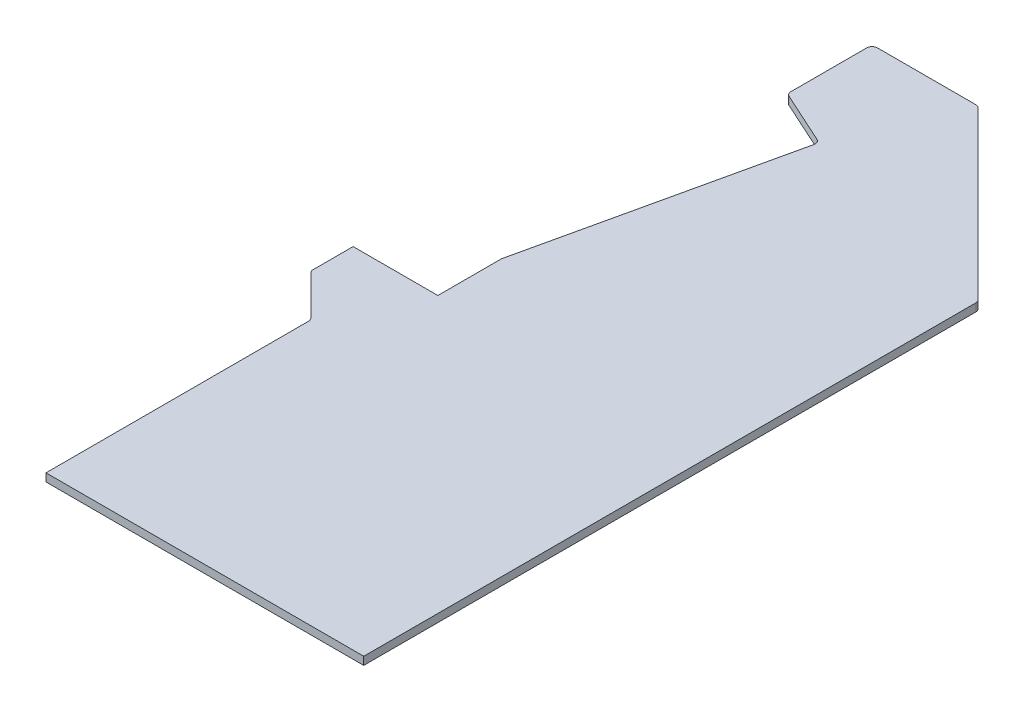
ISO-10303-21;
HEADER;
FILE_DESCRIPTION(('STEP AP214'),'2;1');
FILE_NAME('part.step','',(''),(''),'','','');
FILE_SCHEMA(('AUTOMOTIVE_DESIGN { 1 0 10303 214 1 1 1 1 }'));
ENDSEC;
DATA;
#1=APPLICATION_CONTEXT('core data for automotive mechanical design processes');
#2=APPLICATION_PROTOCOL_DEFINITION('international standard','automotive_design',2000,#1);
#3=PRODUCT_CONTEXT('',#1,'mechanical');
#4=PRODUCT('Part','Part','',(#3));
#5=PRODUCT_RELATED_PRODUCT_CATEGORY('part','',(#4));
#6=PRODUCT_DEFINITION_FORMATION('','',#4);
#7=PRODUCT_DEFINITION_CONTEXT('part definition',#1,'design');
#8=PRODUCT_DEFINITION('design','',#6,#7);
#9=PRODUCT_DEFINITION_SHAPE('','',#8);
#10=(LENGTH_UNIT() NAMED_UNIT(*) SI_UNIT(.MILLI.,.METRE.));
#11=(NAMED_UNIT(*) PLANE_ANGLE_UNIT() SI_UNIT($,.RADIAN.));
#12=(NAMED_UNIT(*) SI_UNIT($,.STERADIAN.) SOLID_ANGLE_UNIT());
#13=UNCERTAINTY_MEASURE_WITH_UNIT(LENGTH_MEASURE(1.E-05),#10,'distance_accuracy_value','');
#14=(GEOMETRIC_REPRESENTATION_CONTEXT(3) GLOBAL_UNCERTAINTY_ASSIGNED_CONTEXT((#13)) GLOBAL_UNIT_ASSIGNED_CONTEXT((#10,
#11,#12)) REPRESENTATION_CONTEXT('',''));
#15=CARTESIAN_POINT('',(0.,0.,0.));
#16=DIRECTION('',(0.,0.,1.));
#17=DIRECTION('',(1.,0.,0.));
#18=AXIS2_PLACEMENT_3D('',#15,#16,#17);
#19=CARTESIAN_POINT('',(-108.534498249528,19.05,3.90321281407813));
#20=DIRECTION('',(0.,0.,-1.));
#21=DIRECTION('',(-1.,0.,0.));
#22=AXIS2_PLACEMENT_3D('',#19,#20,#21);
#23=PLANE('',#22);
#24=DIRECTION('',(1.,0.,0.));
#25=VECTOR('',#24,1.);
#26=CARTESIAN_POINT('',(-108.534498249528,0.,3.90321281407813));
#27=LINE('',#26,#25);
#28=CARTESIAN_POINT('',(-870.534498249528,0.,3.90321281407822));
#29=VERTEX_POINT('',#28);
#30=CARTESIAN_POINT('',(-108.534498249528,0.,3.90321281407813));
#31=VERTEX_POINT('',#30);
#32=EDGE_CURVE('E194',#29,#31,#27,.T.);
#33=ORIENTED_EDGE('',*,*,#32,.T.);
#34=DIRECTION('',(0.,-1.,0.));
#35=VECTOR('',#34,1.);
#36=CARTESIAN_POINT('',(-108.534498249528,19.05,3.90321281407813));
#37=LINE('',#36,#35);
#38=CARTESIAN_POINT('',(-108.534498249528,19.05,3.90321281407813));
#39=VERTEX_POINT('',#38);
#40=EDGE_CURVE('E11',#39,#31,#37,.T.);
#41=ORIENTED_EDGE('',*,*,#40,.F.);
#42=DIRECTION('',(1.,0.,0.));
#43=VECTOR('',#42,1.);
#44=CARTESIAN_POINT('',(-108.534498249528,19.05,3.90321281407813));
#45=LINE('',#44,#43);
#46=CARTESIAN_POINT('',(-870.534498249528,19.05,3.90321281407822));
#47=VERTEX_POINT('',#46);
#48=EDGE_CURVE('E230',#47,#39,#45,.T.);
#49=ORIENTED_EDGE('',*,*,#48,.F.);
#50=DIRECTION('',(0.,-1.,0.));
#51=VECTOR('',#50,1.);
#52=CARTESIAN_POINT('',(-870.534498249528,19.05,3.90321281407822));
#53=LINE('',#52,#51);
#54=EDGE_CURVE('E190',#47,#29,#53,.T.);
#55=ORIENTED_EDGE('',*,*,#54,.T.);
#56=EDGE_LOOP('',(#33,#41,#49,#55));
#57=FACE_BOUND('',#56,.T.);
#58=ADVANCED_FACE('F32',(#57),#23,.F.);
#59=CARTESIAN_POINT('',(-108.534498249528,19.05,3.90321281407813));
#60=DIRECTION('',(-1.,0.,0.));
#61=DIRECTION('',(0.,0.,1.));
#62=AXIS2_PLACEMENT_3D('',#59,#60,#61);
#63=PLANE('',#62);
#64=DIRECTION('',(0.,0.,-1.));
#65=VECTOR('',#64,1.);
#66=CARTESIAN_POINT('',(-108.534498249528,0.,3.90321281407813));
#67=LINE('',#66,#65);
#68=CARTESIAN_POINT('',(-108.534498249528,0.,-1464.03627494378));
#69=VERTEX_POINT('',#68);
#70=EDGE_CURVE('E197',#31,#69,#67,.T.);
#71=ORIENTED_EDGE('',*,*,#70,.T.);
#72=DIRECTION('',(0.,-1.,0.));
#73=VECTOR('',#72,1.);
#74=CARTESIAN_POINT('',(-108.534498249528,19.05,-1464.03627494378));
#75=LINE('',#74,#73);
#76=CARTESIAN_POINT('',(-108.534498249528,19.05,-1464.03627494378));
#77=VERTEX_POINT('',#76);
#78=EDGE_CURVE('E40',#77,#69,#75,.T.);
#79=ORIENTED_EDGE('',*,*,#78,.F.);
#80=DIRECTION('',(0.,0.,-1.));
#81=VECTOR('',#80,1.);
#82=CARTESIAN_POINT('',(-108.534498249528,19.05,3.90321281407813));
#83=LINE('',#82,#81);
#84=EDGE_CURVE('E124',#39,#77,#83,.T.);
#85=ORIENTED_EDGE('',*,*,#84,.F.);
#86=ORIENTED_EDGE('',*,*,#40,.T.);
#87=EDGE_LOOP('',(#71,#79,#85,#86));
#88=FACE_BOUND('',#87,.T.);
#89=ADVANCED_FACE('F343',(#88),#63,.F.);
#90=CARTESIAN_POINT('',(-121.234498249528,19.05,-1464.03627494378));
#91=DIRECTION('',(0.,-1.,0.));
#92=DIRECTION('',(0.,0.,-1.));
#93=AXIS2_PLACEMENT_3D('',#90,#91,#92);
#94=CYLINDRICAL_SURFACE('',#93,12.7);
#95=CARTESIAN_POINT('',(-121.234498249528,0.,-1464.03627494378));
#96=DIRECTION('',(0.,1.,0.));
#97=DIRECTION('',(0.,0.,1.));
#98=AXIS2_PLACEMENT_3D('',#95,#96,#97);
#99=CIRCLE('',#98,12.7);
#100=CARTESIAN_POINT('',(-112.254242128458,0.,-1473.01653106485));
#101=VERTEX_POINT('',#100);
#102=EDGE_CURVE('E199',#69,#101,#99,.T.);
#103=ORIENTED_EDGE('',*,*,#102,.T.);
#104=DIRECTION('',(0.,-1.,0.));
#105=VECTOR('',#104,1.);
#106=CARTESIAN_POINT('',(-112.254242128458,19.05,-1473.01653106485));
#107=LINE('',#106,#105);
#108=CARTESIAN_POINT('',(-112.254242128458,19.05,-1473.01653106485));
#109=VERTEX_POINT('',#108);
#110=EDGE_CURVE('E270',#109,#101,#107,.T.);
#111=ORIENTED_EDGE('',*,*,#110,.F.);
#112=CARTESIAN_POINT('',(-121.234498249528,19.05,-1464.03627494378));
#113=DIRECTION('',(0.,1.,0.));
#114=DIRECTION('',(0.,0.,1.));
#115=AXIS2_PLACEMENT_3D('',#112,#113,#114);
#116=CIRCLE('',#115,12.7);
#117=EDGE_CURVE('E278',#77,#109,#116,.T.);
#118=ORIENTED_EDGE('',*,*,#117,.F.);
#119=ORIENTED_EDGE('',*,*,#78,.T.);
#120=EDGE_LOOP('',(#103,#111,#118,#119));
#121=FACE_BOUND('',#120,.T.);
#122=ADVANCED_FACE('F276',(#121),#94,.T.);
#123=CARTESIAN_POINT('',(-112.254242128458,19.05,-1473.01653106485));
#124=DIRECTION('',(-0.707106781186548,0.,0.707106781186547));
#125=DIRECTION('',(0.707106781186547,0.,0.707106781186548));
#126=AXIS2_PLACEMENT_3D('',#123,#124,#125);
#127=PLANE('',#126);
#128=DIRECTION('',(-0.707106781186548,0.,-0.707106781186548));
#129=VECTOR('',#128,1.);
#130=CARTESIAN_POINT('',(-112.254242128458,0.,-1473.01653106485));
#131=LINE('',#130,#129);
#132=CARTESIAN_POINT('',(-511.214754370597,0.,-1871.97704330699));
#133=VERTEX_POINT('',#132);
#134=EDGE_CURVE('E201',#101,#133,#131,.T.);
#135=ORIENTED_EDGE('',*,*,#134,.T.);
#136=DIRECTION('',(0.,-1.,0.));
#137=VECTOR('',#136,1.);
#138=CARTESIAN_POINT('',(-511.214754370597,19.05,-1871.97704330699));
#139=LINE('',#138,#137);
#140=CARTESIAN_POINT('',(-511.214754370597,19.05,-1871.97704330699));
#141=VERTEX_POINT('',#140);
#142=EDGE_CURVE('E267',#141,#133,#139,.T.);
#143=ORIENTED_EDGE('',*,*,#142,.F.);
#144=DIRECTION('',(-0.707106781186548,0.,-0.707106781186548));
#145=VECTOR('',#144,1.);
#146=CARTESIAN_POINT('',(-112.254242128458,19.05,-1473.01653106485));
#147=LINE('',#146,#145);
#148=EDGE_CURVE('E296',#109,#141,#147,.T.);
#149=ORIENTED_EDGE('',*,*,#148,.F.);
#150=ORIENTED_EDGE('',*,*,#110,.T.);
#151=EDGE_LOOP('',(#135,#143,#149,#150));
#152=FACE_BOUND('',#151,.T.);
#153=ADVANCED_FACE('F287',(#152),#127,.F.);
#154=CARTESIAN_POINT('',(-520.195010491666,19.05,-1862.99678718592));
#155=DIRECTION('',(0.,-1.,0.));
#156=DIRECTION('',(0.,0.,-1.));
#157=AXIS2_PLACEMENT_3D('',#154,#155,#156);
#158=CYLINDRICAL_SURFACE('',#157,12.6999999999999);
#159=CARTESIAN_POINT('',(-520.195010491666,0.,-1862.99678718592));
#160=DIRECTION('',(0.,1.,0.));
#161=DIRECTION('',(0.,0.,1.));
#162=AXIS2_PLACEMENT_3D('',#159,#160,#161);
#163=CIRCLE('',#162,12.6999999999999);
#164=CARTESIAN_POINT('',(-520.195010491666,0.,-1875.69678718592));
#165=VERTEX_POINT('',#164);
#166=EDGE_CURVE('E203',#133,#165,#163,.T.);
#167=ORIENTED_EDGE('',*,*,#166,.T.);
#168=DIRECTION('',(0.,-1.,0.));
#169=VECTOR('',#168,1.);
#170=CARTESIAN_POINT('',(-520.195010491666,19.05,-1875.69678718592));
#171=LINE('',#170,#169);
#172=CARTESIAN_POINT('',(-520.195010491666,19.05,-1875.69678718592));
#173=VERTEX_POINT('',#172);
#174=EDGE_CURVE('E264',#173,#165,#171,.T.);
#175=ORIENTED_EDGE('',*,*,#174,.F.);
#176=CARTESIAN_POINT('',(-520.195010491666,19.05,-1862.99678718592));
#177=DIRECTION('',(0.,1.,0.));
#178=DIRECTION('',(0.,0.,1.));
#179=AXIS2_PLACEMENT_3D('',#176,#177,#178);
#180=CIRCLE('',#179,12.6999999999999);
#181=EDGE_CURVE('E293',#141,#173,#180,.T.);
#182=ORIENTED_EDGE('',*,*,#181,.F.);
#183=ORIENTED_EDGE('',*,*,#142,.T.);
#184=EDGE_LOOP('',(#167,#175,#182,#183));
#185=FACE_BOUND('',#184,.T.);
#186=ADVANCED_FACE('F291',(#185),#158,.T.);
#187=CARTESIAN_POINT('',(-520.195010491666,19.05,-1875.69678718592));
#188=DIRECTION('',(0.,0.,1.));
#189=DIRECTION('',(1.,0.,0.));
#190=AXIS2_PLACEMENT_3D('',#187,#188,#189);
#191=PLANE('',#190);
#192=DIRECTION('',(-1.,0.,0.));
#193=VECTOR('',#192,1.);
#194=CARTESIAN_POINT('',(-520.195010491666,0.,-1875.69678718592));
#195=LINE('',#194,#193);
#196=CARTESIAN_POINT('',(-756.234498249528,0.,-1875.69678718592));
#197=VERTEX_POINT('',#196);
#198=EDGE_CURVE('E205',#165,#197,#195,.T.);
#199=ORIENTED_EDGE('',*,*,#198,.T.);
#200=DIRECTION('',(0.,-1.,0.));
#201=VECTOR('',#200,1.);
#202=CARTESIAN_POINT('',(-756.234498249528,19.05,-1875.69678718592));
#203=LINE('',#202,#201);
#204=CARTESIAN_POINT('',(-756.234498249528,19.05,-1875.69678718592));
#205=VERTEX_POINT('',#204);
#206=EDGE_CURVE('E261',#205,#197,#203,.T.);
#207=ORIENTED_EDGE('',*,*,#206,.F.);
#208=DIRECTION('',(-1.,0.,0.));
#209=VECTOR('',#208,1.);
#210=CARTESIAN_POINT('',(-520.195010491666,19.05,-1875.69678718592));
#211=LINE('',#210,#209);
#212=EDGE_CURVE('E295',#173,#205,#211,.T.);
#213=ORIENTED_EDGE('',*,*,#212,.F.);
#214=ORIENTED_EDGE('',*,*,#174,.T.);
#215=EDGE_LOOP('',(#199,#207,#213,#214));
#216=FACE_BOUND('',#215,.T.);
#217=ADVANCED_FACE('F356',(#216),#191,.F.);
#218=CARTESIAN_POINT('',(-756.234498249528,19.05,-1862.99678718592));
#219=DIRECTION('',(0.,-1.,0.));
#220=DIRECTION('',(0.,0.,-1.));
#221=AXIS2_PLACEMENT_3D('',#218,#219,#220);
#222=CYLINDRICAL_SURFACE('',#221,12.6999999999999);
#223=CARTESIAN_POINT('',(-756.234498249528,0.,-1862.99678718592));
#224=DIRECTION('',(0.,1.,0.));
#225=DIRECTION('',(0.,0.,-1.));
#226=AXIS2_PLACEMENT_3D('',#223,#224,#225);
#227=CIRCLE('',#226,12.6999999999999);
#228=CARTESIAN_POINT('',(-768.934498249528,0.,-1862.99678718592));
#229=VERTEX_POINT('',#228);
#230=EDGE_CURVE('E207',#197,#229,#227,.T.);
#231=ORIENTED_EDGE('',*,*,#230,.T.);
#232=DIRECTION('',(0.,-1.,0.));
#233=VECTOR('',#232,1.);
#234=CARTESIAN_POINT('',(-768.934498249528,19.05,-1862.99678718592));
#235=LINE('',#234,#233);
#236=CARTESIAN_POINT('',(-768.934498249528,19.05,-1862.99678718592));
#237=VERTEX_POINT('',#236);
#238=EDGE_CURVE('E258',#237,#229,#235,.T.);
#239=ORIENTED_EDGE('',*,*,#238,.F.);
#240=CARTESIAN_POINT('',(-756.234498249528,19.05,-1862.99678718592));
#241=DIRECTION('',(0.,1.,0.));
#242=DIRECTION('',(0.,0.,-1.));
#243=AXIS2_PLACEMENT_3D('',#240,#241,#242);
#244=CIRCLE('',#243,12.6999999999999);
#245=EDGE_CURVE('E298',#205,#237,#244,.T.);
#246=ORIENTED_EDGE('',*,*,#245,.F.);
#247=ORIENTED_EDGE('',*,*,#206,.T.);
#248=EDGE_LOOP('',(#231,#239,#246,#247));
#249=FACE_BOUND('',#248,.T.);
#250=ADVANCED_FACE('F359',(#249),#222,.T.);
#251=CARTESIAN_POINT('',(-768.934498249528,19.05,-1680.67448571907));
#252=DIRECTION('',(1.,0.,0.));
#253=DIRECTION('',(0.,0.,-1.));
#254=AXIS2_PLACEMENT_3D('',#251,#252,#253);
#255=PLANE('',#254);
#256=DIRECTION('',(0.,0.,1.));
#257=VECTOR('',#256,1.);
#258=CARTESIAN_POINT('',(-768.934498249528,0.,-1680.67448571907));
#259=LINE('',#258,#257);
#260=CARTESIAN_POINT('',(-768.934498249528,0.,-1680.67448571907));
#261=VERTEX_POINT('',#260);
#262=EDGE_CURVE('E209',#229,#261,#259,.T.);
#263=ORIENTED_EDGE('',*,*,#262,.T.);
#264=DIRECTION('',(0.,-1.,0.));
#265=VECTOR('',#264,1.);
#266=CARTESIAN_POINT('',(-768.934498249528,19.05,-1680.67448571907));
#267=LINE('',#266,#265);
#268=CARTESIAN_POINT('',(-768.934498249528,19.05,-1680.67448571907));
#269=VERTEX_POINT('',#268);
#270=EDGE_CURVE('E255',#269,#261,#267,.T.);
#271=ORIENTED_EDGE('',*,*,#270,.F.);
#272=DIRECTION('',(0.,0.,1.));
#273=VECTOR('',#272,1.);
#274=CARTESIAN_POINT('',(-768.934498249528,19.05,-1680.67448571907));
#275=LINE('',#274,#273);
#276=EDGE_CURVE('E304',#237,#269,#275,.T.);
#277=ORIENTED_EDGE('',*,*,#276,.F.);
#278=ORIENTED_EDGE('',*,*,#238,.T.);
#279=EDGE_LOOP('',(#263,#271,#277,#278));
#280=FACE_BOUND('',#279,.T.);
#281=ADVANCED_FACE('F363',(#280),#255,.F.);
#282=CARTESIAN_POINT('',(-756.234498249528,19.05,-1680.67448571907));
#283=DIRECTION('',(0.,-1.,0.));
#284=DIRECTION('',(0.,0.,-1.));
#285=AXIS2_PLACEMENT_3D('',#282,#283,#284);
#286=CYLINDRICAL_SURFACE('',#285,12.7);
#287=CARTESIAN_POINT('',(-756.234498249528,0.,-1680.67448571907));
#288=DIRECTION('',(0.,1.,0.));
#289=DIRECTION('',(0.,0.,1.));
#290=AXIS2_PLACEMENT_3D('',#287,#288,#289);
#291=CIRCLE('',#290,12.7);
#292=CARTESIAN_POINT('',(-761.489795642153,0.,-1669.1128314553));
#293=VERTEX_POINT('',#292);
#294=EDGE_CURVE('E211',#261,#293,#291,.T.);
#295=ORIENTED_EDGE('',*,*,#294,.T.);
#296=DIRECTION('',(0.,-1.,0.));
#297=VECTOR('',#296,1.);
#298=CARTESIAN_POINT('',(-761.489795642153,19.05,-1669.1128314553));
#299=LINE('',#298,#297);
#300=CARTESIAN_POINT('',(-761.489795642153,19.05,-1669.1128314553));
#301=VERTEX_POINT('',#300);
#302=EDGE_CURVE('E252',#301,#293,#299,.T.);
#303=ORIENTED_EDGE('',*,*,#302,.F.);
#304=CARTESIAN_POINT('',(-756.234498249528,19.05,-1680.67448571907));
#305=DIRECTION('',(0.,1.,0.));
#306=DIRECTION('',(0.,0.,1.));
#307=AXIS2_PLACEMENT_3D('',#304,#305,#306);
#308=CIRCLE('',#307,12.7);
#309=EDGE_CURVE('E306',#269,#301,#308,.T.);
#310=ORIENTED_EDGE('',*,*,#309,.F.);
#311=ORIENTED_EDGE('',*,*,#270,.T.);
#312=EDGE_LOOP('',(#295,#303,#310,#311));
#313=FACE_BOUND('',#312,.T.);
#314=ADVANCED_FACE('F367',(#313),#286,.T.);
#315=CARTESIAN_POINT('',(-761.489795642153,19.05,-1669.1128314553));
#316=DIRECTION('',(0.413802944301183,0.,-0.910366477462605));
#317=DIRECTION('',(-0.910366477462605,0.,-0.413802944301183));
#318=AXIS2_PLACEMENT_3D('',#315,#316,#317);
#319=PLANE('',#318);
#320=DIRECTION('',(0.910366477462605,0.,0.413802944301183));
#321=VECTOR('',#320,1.);
#322=CARTESIAN_POINT('',(-761.489795642153,0.,-1669.1128314553));
#323=LINE('',#322,#321);
#324=CARTESIAN_POINT('',(-638.631840930286,0.,-1613.26830658627));
#325=VERTEX_POINT('',#324);
#326=EDGE_CURVE('E213',#293,#325,#323,.T.);
#327=ORIENTED_EDGE('',*,*,#326,.T.);
#328=DIRECTION('',(0.,-1.,0.));
#329=VECTOR('',#328,1.);
#330=CARTESIAN_POINT('',(-638.631840930286,19.05,-1613.26830658627));
#331=LINE('',#330,#329);
#332=CARTESIAN_POINT('',(-638.631840930286,19.05,-1613.26830658627));
#333=VERTEX_POINT('',#332);
#334=EDGE_CURVE('E249',#333,#325,#331,.T.);
#335=ORIENTED_EDGE('',*,*,#334,.F.);
#336=DIRECTION('',(0.910366477462605,0.,0.413802944301183));
#337=VECTOR('',#336,1.);
#338=CARTESIAN_POINT('',(-761.489795642153,19.05,-1669.1128314553));
#339=LINE('',#338,#337);
#340=EDGE_CURVE('E308',#301,#333,#339,.T.);
#341=ORIENTED_EDGE('',*,*,#340,.F.);
#342=ORIENTED_EDGE('',*,*,#302,.T.);
#343=EDGE_LOOP('',(#327,#335,#341,#342));
#344=FACE_BOUND('',#343,.T.);
#345=ADVANCED_FACE('F371',(#344),#319,.F.);
#346=CARTESIAN_POINT('',(-643.887138322911,19.05,-1601.70665232249));
#347=DIRECTION('',(0.,-1.,0.));
#348=DIRECTION('',(0.,0.,-1.));
#349=AXIS2_PLACEMENT_3D('',#346,#347,#348);
#350=CYLINDRICAL_SURFACE('',#349,12.7);
#351=CARTESIAN_POINT('',(-643.887138322911,0.,-1601.70665232249));
#352=DIRECTION('',(0.,-1.,0.));
#353=DIRECTION('',(0.,0.,1.));
#354=AXIS2_PLACEMENT_3D('',#351,#352,#353);
#355=CIRCLE('',#354,12.7);
#356=CARTESIAN_POINT('',(-631.495541921323,0.,-1598.9248653752));
#357=VERTEX_POINT('',#356);
#358=EDGE_CURVE('E215',#325,#357,#355,.T.);
#359=ORIENTED_EDGE('',*,*,#358,.T.);
#360=DIRECTION('',(0.,-1.,0.));
#361=VECTOR('',#360,1.);
#362=CARTESIAN_POINT('',(-631.495541921323,19.05,-1598.9248653752));
#363=LINE('',#362,#361);
#364=CARTESIAN_POINT('',(-631.495541921323,19.05,-1598.9248653752));
#365=VERTEX_POINT('',#364);
#366=EDGE_CURVE('E246',#365,#357,#363,.T.);
#367=ORIENTED_EDGE('',*,*,#366,.F.);
#368=CARTESIAN_POINT('',(-643.887138322911,19.05,-1601.70665232249));
#369=DIRECTION('',(0.,-1.,0.));
#370=DIRECTION('',(0.,0.,1.));
#371=AXIS2_PLACEMENT_3D('',#368,#369,#370);
#372=CIRCLE('',#371,12.7);
#373=EDGE_CURVE('E310',#333,#365,#372,.T.);
#374=ORIENTED_EDGE('',*,*,#373,.F.);
#375=ORIENTED_EDGE('',*,*,#334,.T.);
#376=EDGE_LOOP('',(#359,#367,#374,#375));
#377=FACE_BOUND('',#376,.T.);
#378=ADVANCED_FACE('F375',(#377),#350,.F.);
#379=CARTESIAN_POINT('',(-631.495541921323,19.05,-1598.9248653752));
#380=DIRECTION('',(0.975716252093571,0.,0.21903834230672));
#381=DIRECTION('',(0.21903834230672,0.,-0.975716252093571));
#382=AXIS2_PLACEMENT_3D('',#379,#380,#381);
#383=PLANE('',#382);
#384=DIRECTION('',(-0.21903834230672,0.,0.97571625209357));
#385=VECTOR('',#384,1.);
#386=CARTESIAN_POINT('',(-631.495541921323,0.,-1598.9248653752));
#387=LINE('',#386,#385);
#388=CARTESIAN_POINT('',(-768.934498249528,0.,-986.696787185922));
#389=VERTEX_POINT('',#388);
#390=EDGE_CURVE('E217',#357,#389,#387,.T.);
#391=ORIENTED_EDGE('',*,*,#390,.T.);
#392=DIRECTION('',(0.,-1.,0.));
#393=VECTOR('',#392,1.);
#394=CARTESIAN_POINT('',(-768.934498249528,19.05,-986.696787185922));
#395=LINE('',#394,#393);
#396=CARTESIAN_POINT('',(-768.934498249528,19.05,-986.696787185922));
#397=VERTEX_POINT('',#396);
#398=EDGE_CURVE('E243',#397,#389,#395,.T.);
#399=ORIENTED_EDGE('',*,*,#398,.F.);
#400=DIRECTION('',(-0.21903834230672,0.,0.97571625209357));
#401=VECTOR('',#400,1.);
#402=CARTESIAN_POINT('',(-631.495541921323,19.05,-1598.9248653752));
#403=LINE('',#402,#401);
#404=EDGE_CURVE('E312',#365,#397,#403,.T.);
#405=ORIENTED_EDGE('',*,*,#404,.F.);
#406=ORIENTED_EDGE('',*,*,#366,.T.);
#407=EDGE_LOOP('',(#391,#399,#405,#406));
#408=FACE_BOUND('',#407,.T.);
#409=ADVANCED_FACE('F379',(#408),#383,.F.);
#410=CARTESIAN_POINT('',(-768.934498249528,19.05,-834.296787185922));
#411=DIRECTION('',(1.,0.,0.));
#412=DIRECTION('',(0.,0.,-1.));
#413=AXIS2_PLACEMENT_3D('',#410,#411,#412);
#414=PLANE('',#413);
#415=DIRECTION('',(0.,0.,1.));
#416=VECTOR('',#415,1.);
#417=CARTESIAN_POINT('',(-768.934498249528,0.,-834.296787185922));
#418=LINE('',#417,#416);
#419=CARTESIAN_POINT('',(-768.934498249528,0.,-834.296787185922));
#420=VERTEX_POINT('',#419);
#421=EDGE_CURVE('E219',#389,#420,#418,.T.);
#422=ORIENTED_EDGE('',*,*,#421,.T.);
#423=DIRECTION('',(0.,-1.,0.));
#424=VECTOR('',#423,1.);
#425=CARTESIAN_POINT('',(-768.934498249528,19.05,-834.296787185922));
#426=LINE('',#425,#424);
#427=CARTESIAN_POINT('',(-768.934498249528,19.05,-834.296787185922));
#428=VERTEX_POINT('',#427);
#429=EDGE_CURVE('E240',#428,#420,#426,.T.);
#430=ORIENTED_EDGE('',*,*,#429,.F.);
#431=DIRECTION('',(0.,0.,1.));
#432=VECTOR('',#431,1.);
#433=CARTESIAN_POINT('',(-768.934498249528,19.05,-834.296787185922));
#434=LINE('',#433,#432);
#435=EDGE_CURVE('E314',#397,#428,#434,.T.);
#436=ORIENTED_EDGE('',*,*,#435,.F.);
#437=ORIENTED_EDGE('',*,*,#398,.T.);
#438=EDGE_LOOP('',(#422,#430,#436,#437));
#439=FACE_BOUND('',#438,.T.);
#440=ADVANCED_FACE('F383',(#439),#414,.F.);
#441=CARTESIAN_POINT('',(-972.134498249528,19.05,-834.296787185922));
#442=DIRECTION('',(0.,0.,1.));
#443=DIRECTION('',(1.,0.,0.));
#444=AXIS2_PLACEMENT_3D('',#441,#442,#443);
#445=PLANE('',#444);
#446=DIRECTION('',(-1.,0.,0.));
#447=VECTOR('',#446,1.);
#448=CARTESIAN_POINT('',(-972.134498249528,0.,-834.296787185922));
#449=LINE('',#448,#447);
#450=CARTESIAN_POINT('',(-972.134498249528,0.,-834.296787185922));
#451=VERTEX_POINT('',#450);
#452=EDGE_CURVE('E221',#420,#451,#449,.T.);
#453=ORIENTED_EDGE('',*,*,#452,.T.);
#454=DIRECTION('',(0.,-1.,0.));
#455=VECTOR('',#454,1.);
#456=CARTESIAN_POINT('',(-972.134498249528,19.05,-834.296787185922));
#457=LINE('',#456,#455);
#458=CARTESIAN_POINT('',(-972.134498249528,19.05,-834.296787185922));
#459=VERTEX_POINT('',#458);
#460=EDGE_CURVE('E237',#459,#451,#457,.T.);
#461=ORIENTED_EDGE('',*,*,#460,.F.);
#462=DIRECTION('',(-1.,0.,0.));
#463=VECTOR('',#462,1.);
#464=CARTESIAN_POINT('',(-972.134498249528,19.05,-834.296787185922));
#465=LINE('',#464,#463);
#466=EDGE_CURVE('E316',#428,#459,#465,.T.);
#467=ORIENTED_EDGE('',*,*,#466,.F.);
#468=ORIENTED_EDGE('',*,*,#429,.T.);
#469=EDGE_LOOP('',(#453,#461,#467,#468));
#470=FACE_BOUND('',#469,.T.);
#471=ADVANCED_FACE('F387',(#470),#445,.F.);
#472=CARTESIAN_POINT('',(-972.134498249528,19.05,-737.95729942806));
#473=DIRECTION('',(1.,0.,0.));
#474=DIRECTION('',(0.,0.,-1.));
#475=AXIS2_PLACEMENT_3D('',#472,#473,#474);
#476=PLANE('',#475);
#477=DIRECTION('',(0.,0.,1.));
#478=VECTOR('',#477,1.);
#479=CARTESIAN_POINT('',(-972.134498249528,0.,-737.95729942806));
#480=LINE('',#479,#478);
#481=CARTESIAN_POINT('',(-972.134498249528,0.,-737.95729942806));
#482=VERTEX_POINT('',#481);
#483=EDGE_CURVE('E223',#451,#482,#480,.T.);
#484=ORIENTED_EDGE('',*,*,#483,.T.);
#485=DIRECTION('',(0.,-1.,0.));
#486=VECTOR('',#485,1.);
#487=CARTESIAN_POINT('',(-972.134498249528,19.05,-737.95729942806));
#488=LINE('',#487,#486);
#489=CARTESIAN_POINT('',(-972.134498249528,19.05,-737.95729942806));
#490=VERTEX_POINT('',#489);
#491=EDGE_CURVE('E234',#490,#482,#488,.T.);
#492=ORIENTED_EDGE('',*,*,#491,.F.);
#493=DIRECTION('',(0.,0.,1.));
#494=VECTOR('',#493,1.);
#495=CARTESIAN_POINT('',(-972.134498249528,19.05,-737.95729942806));
#496=LINE('',#495,#494);
#497=EDGE_CURVE('E318',#459,#490,#496,.T.);
#498=ORIENTED_EDGE('',*,*,#497,.F.);
#499=ORIENTED_EDGE('',*,*,#460,.T.);
#500=EDGE_LOOP('',(#484,#492,#498,#499));
#501=FACE_BOUND('',#500,.T.);
#502=ADVANCED_FACE('F324',(#501),#476,.F.);
#503=CARTESIAN_POINT('',(-959.434498249528,19.05,-737.95729942806));
#504=DIRECTION('',(0.,-1.,0.));
#505=DIRECTION('',(0.,0.,-1.));
#506=AXIS2_PLACEMENT_3D('',#503,#504,#505);
#507=CYLINDRICAL_SURFACE('',#506,12.7);
#508=CARTESIAN_POINT('',(-959.434498249528,0.,-737.95729942806));
#509=DIRECTION('',(0.,1.,0.));
#510=DIRECTION('',(0.,0.,1.));
#511=AXIS2_PLACEMENT_3D('',#508,#509,#510);
#512=CIRCLE('',#511,12.7);
#513=CARTESIAN_POINT('',(-968.414754370597,0.,-728.977043306991));
#514=VERTEX_POINT('',#513);
#515=EDGE_CURVE('E225',#482,#514,#512,.T.);
#516=ORIENTED_EDGE('',*,*,#515,.T.);
#517=DIRECTION('',(0.,-1.,0.));
#518=VECTOR('',#517,1.);
#519=CARTESIAN_POINT('',(-968.414754370597,19.05,-728.977043306991));
#520=LINE('',#519,#518);
#521=CARTESIAN_POINT('',(-968.414754370597,19.05,-728.977043306991));
#522=VERTEX_POINT('',#521);
#523=EDGE_CURVE('E185',#522,#514,#520,.T.);
#524=ORIENTED_EDGE('',*,*,#523,.F.);
#525=CARTESIAN_POINT('',(-959.434498249528,19.05,-737.95729942806));
#526=DIRECTION('',(0.,1.,0.));
#527=DIRECTION('',(0.,0.,1.));
#528=AXIS2_PLACEMENT_3D('',#525,#526,#527);
#529=CIRCLE('',#528,12.7);
#530=EDGE_CURVE('E176',#490,#522,#529,.T.);
#531=ORIENTED_EDGE('',*,*,#530,.F.);
#532=ORIENTED_EDGE('',*,*,#491,.T.);
#533=EDGE_LOOP('',(#516,#524,#531,#532));
#534=FACE_BOUND('',#533,.T.);
#535=ADVANCED_FACE('F328',(#534),#507,.T.);
#536=CARTESIAN_POINT('',(-968.414754370597,19.05,-728.977043306991));
#537=DIRECTION('',(0.707106781186547,0.,-0.707106781186548));
#538=DIRECTION('',(-0.707106781186548,0.,-0.707106781186547));
#539=AXIS2_PLACEMENT_3D('',#536,#537,#538);
#540=PLANE('',#539);
#541=DIRECTION('',(0.707106781186548,0.,0.707106781186547));
#542=VECTOR('',#541,1.);
#543=CARTESIAN_POINT('',(-968.414754370597,0.,-728.977043306991));
#544=LINE('',#543,#542);
#545=CARTESIAN_POINT('',(-874.254242128458,0.,-634.816531064853));
#546=VERTEX_POINT('',#545);
#547=EDGE_CURVE('E184',#514,#546,#544,.T.);
#548=ORIENTED_EDGE('',*,*,#547,.T.);
#549=DIRECTION('',(0.,-1.,0.));
#550=VECTOR('',#549,1.);
#551=CARTESIAN_POINT('',(-874.254242128458,19.05,-634.816531064853));
#552=LINE('',#551,#550);
#553=CARTESIAN_POINT('',(-874.254242128458,19.05,-634.816531064853));
#554=VERTEX_POINT('',#553);
#555=EDGE_CURVE('E181',#554,#546,#552,.T.);
#556=ORIENTED_EDGE('',*,*,#555,.F.);
#557=DIRECTION('',(0.707106781186548,0.,0.707106781186547));
#558=VECTOR('',#557,1.);
#559=CARTESIAN_POINT('',(-968.414754370597,19.05,-728.977043306991));
#560=LINE('',#559,#558);
#561=EDGE_CURVE('E170',#522,#554,#560,.T.);
#562=ORIENTED_EDGE('',*,*,#561,.F.);
#563=ORIENTED_EDGE('',*,*,#523,.T.);
#564=EDGE_LOOP('',(#548,#556,#562,#563));
#565=FACE_BOUND('',#564,.T.);
#566=ADVANCED_FACE('F182',(#565),#540,.F.);
#567=CARTESIAN_POINT('',(-883.234498249528,19.05,-625.836274943783));
#568=DIRECTION('',(0.,-1.,0.));
#569=DIRECTION('',(0.,0.,-1.));
#570=AXIS2_PLACEMENT_3D('',#567,#568,#569);
#571=CYLINDRICAL_SURFACE('',#570,12.7);
#572=CARTESIAN_POINT('',(-883.234498249528,0.,-625.836274943783));
#573=DIRECTION('',(0.,-1.,0.));
#574=DIRECTION('',(0.,0.,1.));
#575=AXIS2_PLACEMENT_3D('',#572,#573,#574);
#576=CIRCLE('',#575,12.7);
#577=CARTESIAN_POINT('',(-870.534498249528,0.,-625.836274943783));
#578=VERTEX_POINT('',#577);
#579=EDGE_CURVE('E110',#546,#578,#576,.T.);
#580=ORIENTED_EDGE('',*,*,#579,.T.);
#581=DIRECTION('',(0.,-1.,0.));
#582=VECTOR('',#581,1.);
#583=CARTESIAN_POINT('',(-870.534498249528,19.05,-625.836274943783));
#584=LINE('',#583,#582);
#585=CARTESIAN_POINT('',(-870.534498249528,19.05,-625.836274943783));
#586=VERTEX_POINT('',#585);
#587=EDGE_CURVE('E186',#586,#578,#584,.T.);
#588=ORIENTED_EDGE('',*,*,#587,.F.);
#589=CARTESIAN_POINT('',(-883.234498249528,19.05,-625.836274943783));
#590=DIRECTION('',(0.,-1.,0.));
#591=DIRECTION('',(0.,0.,1.));
#592=AXIS2_PLACEMENT_3D('',#589,#590,#591);
#593=CIRCLE('',#592,12.7);
#594=EDGE_CURVE('E174',#554,#586,#593,.T.);
#595=ORIENTED_EDGE('',*,*,#594,.F.);
#596=ORIENTED_EDGE('',*,*,#555,.T.);
#597=EDGE_LOOP('',(#580,#588,#595,#596));
#598=FACE_BOUND('',#597,.T.);
#599=ADVANCED_FACE('F188',(#598),#571,.F.);
#600=CARTESIAN_POINT('',(-870.534498249528,19.05,3.90321281407822));
#601=DIRECTION('',(1.,0.,0.));
#602=DIRECTION('',(0.,0.,-1.));
#603=AXIS2_PLACEMENT_3D('',#600,#601,#602);
#604=PLANE('',#603);
#605=DIRECTION('',(0.,0.,1.));
#606=VECTOR('',#605,1.);
#607=CARTESIAN_POINT('',(-870.534498249528,0.,3.90321281407822));
#608=LINE('',#607,#606);
#609=EDGE_CURVE('E116',#578,#29,#608,.T.);
#610=ORIENTED_EDGE('',*,*,#609,.T.);
#611=ORIENTED_EDGE('',*,*,#54,.F.);
#612=DIRECTION('',(0.,0.,1.));
#613=VECTOR('',#612,1.);
#614=CARTESIAN_POINT('',(-870.534498249528,19.05,3.90321281407822));
#615=LINE('',#614,#613);
#616=EDGE_CURVE('E48',#586,#47,#615,.T.);
#617=ORIENTED_EDGE('',*,*,#616,.F.);
#618=ORIENTED_EDGE('',*,*,#587,.T.);
#619=EDGE_LOOP('',(#610,#611,#617,#618));
#620=FACE_BOUND('',#619,.T.);
#621=ADVANCED_FACE('F332',(#620),#604,.F.);
#622=CARTESIAN_POINT('',(-883.234498249528,19.05,-625.836274943783));
#623=DIRECTION('',(0.,1.,0.));
#624=DIRECTION('',(0.,0.,1.));
#625=AXIS2_PLACEMENT_3D('',#622,#623,#624);
#626=PLANE('',#625);
#627=ORIENTED_EDGE('',*,*,#48,.T.);
#628=ORIENTED_EDGE('',*,*,#84,.T.);
#629=ORIENTED_EDGE('',*,*,#117,.T.);
#630=ORIENTED_EDGE('',*,*,#148,.T.);
#631=ORIENTED_EDGE('',*,*,#181,.T.);
#632=ORIENTED_EDGE('',*,*,#212,.T.);
#633=ORIENTED_EDGE('',*,*,#245,.T.);
#634=ORIENTED_EDGE('',*,*,#276,.T.);
#635=ORIENTED_EDGE('',*,*,#309,.T.);
#636=ORIENTED_EDGE('',*,*,#340,.T.);
#637=ORIENTED_EDGE('',*,*,#373,.T.);
#638=ORIENTED_EDGE('',*,*,#404,.T.);
#639=ORIENTED_EDGE('',*,*,#435,.T.);
#640=ORIENTED_EDGE('',*,*,#466,.T.);
#641=ORIENTED_EDGE('',*,*,#497,.T.);
#642=ORIENTED_EDGE('',*,*,#530,.T.);
#643=ORIENTED_EDGE('',*,*,#561,.T.);
#644=ORIENTED_EDGE('',*,*,#594,.T.);
#645=ORIENTED_EDGE('',*,*,#616,.T.);
#646=EDGE_LOOP('',(#627,#628,#629,#630,#631,#632,#633,#634,#635,#636,#637,#638,#639,#640,#641,
#642,#643,#644,#645));
#647=FACE_BOUND('',#646,.T.);
#648=ADVANCED_FACE('F172',(#647),#626,.T.);
#649=CARTESIAN_POINT('',(-883.234498249528,0.,-625.836274943783));
#650=DIRECTION('',(0.,1.,0.));
#651=DIRECTION('',(0.,0.,1.));
#652=AXIS2_PLACEMENT_3D('',#649,#650,#651);
#653=PLANE('',#652);
#654=ORIENTED_EDGE('',*,*,#32,.F.);
#655=ORIENTED_EDGE('',*,*,#609,.F.);
#656=ORIENTED_EDGE('',*,*,#579,.F.);
#657=ORIENTED_EDGE('',*,*,#547,.F.);
#658=ORIENTED_EDGE('',*,*,#515,.F.);
#659=ORIENTED_EDGE('',*,*,#483,.F.);
#660=ORIENTED_EDGE('',*,*,#452,.F.);
#661=ORIENTED_EDGE('',*,*,#421,.F.);
#662=ORIENTED_EDGE('',*,*,#390,.F.);
#663=ORIENTED_EDGE('',*,*,#358,.F.);
#664=ORIENTED_EDGE('',*,*,#326,.F.);
#665=ORIENTED_EDGE('',*,*,#294,.F.);
#666=ORIENTED_EDGE('',*,*,#262,.F.);
#667=ORIENTED_EDGE('',*,*,#230,.F.);
#668=ORIENTED_EDGE('',*,*,#198,.F.);
#669=ORIENTED_EDGE('',*,*,#166,.F.);
#670=ORIENTED_EDGE('',*,*,#134,.F.);
#671=ORIENTED_EDGE('',*,*,#102,.F.);
#672=ORIENTED_EDGE('',*,*,#70,.F.);
#673=EDGE_LOOP('',(#654,#655,#656,#657,#658,#659,#660,#661,#662,#663,#664,#665,#666,#667,#668,
#669,#670,#671,#672));
#674=FACE_BOUND('',#673,.T.);
#675=ADVANCED_FACE('F282',(#674),#653,.F.);
#676=CLOSED_SHELL('',(#58,#89,#122,#153,#186,#217,#250,#281,#314,#345,#378,#409,#440,#471,#502,
#535,#566,#599,#621,#648,#675));
#677=MANIFOLD_SOLID_BREP('B2',#676);
#678=ADVANCED_BREP_SHAPE_REPRESENTATION('',(#18,#677),#14);
#679=SHAPE_DEFINITION_REPRESENTATION(#9,#678);
ENDSEC;
END-ISO-10303-21;
